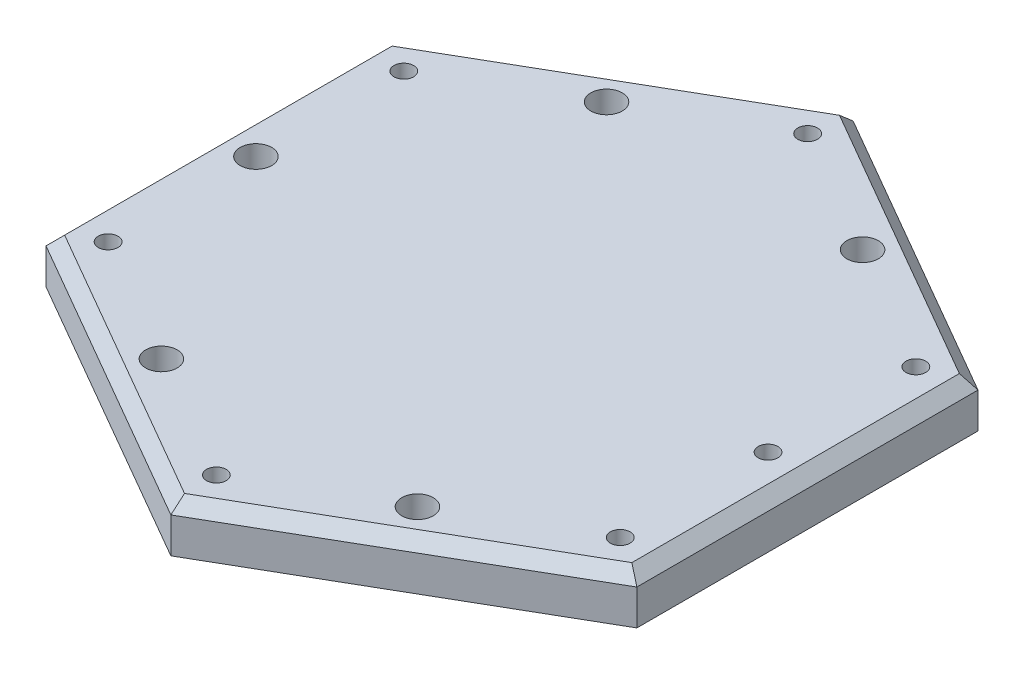
ISO-10303-21;
HEADER;
FILE_DESCRIPTION(('STEP AP214'),'2;1');
FILE_NAME('part.step','',(''),(''),'','','');
FILE_SCHEMA(('AUTOMOTIVE_DESIGN { 1 0 10303 214 1 1 1 1 }'));
ENDSEC;
DATA;
#1=APPLICATION_CONTEXT('core data for automotive mechanical design processes');
#2=APPLICATION_PROTOCOL_DEFINITION('international standard','automotive_design',2000,#1);
#3=PRODUCT_CONTEXT('',#1,'mechanical');
#4=PRODUCT('Part','Part','',(#3));
#5=PRODUCT_RELATED_PRODUCT_CATEGORY('part','',(#4));
#6=PRODUCT_DEFINITION_FORMATION('','',#4);
#7=PRODUCT_DEFINITION_CONTEXT('part definition',#1,'design');
#8=PRODUCT_DEFINITION('design','',#6,#7);
#9=PRODUCT_DEFINITION_SHAPE('','',#8);
#10=(LENGTH_UNIT() NAMED_UNIT(*) SI_UNIT(.MILLI.,.METRE.));
#11=(NAMED_UNIT(*) PLANE_ANGLE_UNIT() SI_UNIT($,.RADIAN.));
#12=(NAMED_UNIT(*) SI_UNIT($,.STERADIAN.) SOLID_ANGLE_UNIT());
#13=UNCERTAINTY_MEASURE_WITH_UNIT(LENGTH_MEASURE(1.E-05),#10,'distance_accuracy_value','');
#14=(GEOMETRIC_REPRESENTATION_CONTEXT(3) GLOBAL_UNCERTAINTY_ASSIGNED_CONTEXT((#13)) GLOBAL_UNIT_ASSIGNED_CONTEXT((#10,
#11,#12)) REPRESENTATION_CONTEXT('',''));
#15=CARTESIAN_POINT('',(0.,0.,0.));
#16=DIRECTION('',(0.,0.,1.));
#17=DIRECTION('',(1.,0.,0.));
#18=AXIS2_PLACEMENT_3D('',#15,#16,#17);
#19=CARTESIAN_POINT('',(74.9999999999996,12.,-43.3012701892228));
#20=DIRECTION('',(-0.499999999999995,0.,0.866025403784441));
#21=DIRECTION('',(0.866025403784442,0.,0.499999999999995));
#22=AXIS2_PLACEMENT_3D('',#19,#20,#21);
#23=PLANE('',#22);
#24=DIRECTION('',(0.,-1.,0.));
#25=VECTOR('',#24,1.);
#26=CARTESIAN_POINT('',(0.,12.,-86.6025403784439));
#27=LINE('',#26,#25);
#28=CARTESIAN_POINT('',(0.,9.,-86.6025403784439));
#29=VERTEX_POINT('',#28);
#30=CARTESIAN_POINT('',(0.,0.,-86.6025403784439));
#31=VERTEX_POINT('',#30);
#32=EDGE_CURVE('E109',#29,#31,#27,.T.);
#33=ORIENTED_EDGE('',*,*,#32,.F.);
#34=DIRECTION('',(0.866025403784442,0.,0.499999999999995));
#35=VECTOR('',#34,1.);
#36=CARTESIAN_POINT('',(74.9999999999996,9.,-43.3012701892228));
#37=LINE('',#36,#35);
#38=CARTESIAN_POINT('',(74.9999999999996,9.,-43.3012701892228));
#39=VERTEX_POINT('',#38);
#40=EDGE_CURVE('E11',#29,#39,#37,.T.);
#41=ORIENTED_EDGE('',*,*,#40,.T.);
#42=DIRECTION('',(0.,-1.,0.));
#43=VECTOR('',#42,1.);
#44=CARTESIAN_POINT('',(74.9999999999996,12.,-43.3012701892228));
#45=LINE('',#44,#43);
#46=CARTESIAN_POINT('',(74.9999999999996,0.,-43.3012701892228));
#47=VERTEX_POINT('',#46);
#48=EDGE_CURVE('E130',#39,#47,#45,.T.);
#49=ORIENTED_EDGE('',*,*,#48,.T.);
#50=DIRECTION('',(-0.866025403784442,0.,-0.499999999999995));
#51=VECTOR('',#50,1.);
#52=CARTESIAN_POINT('',(74.9999999999996,0.,-43.3012701892228));
#53=LINE('',#52,#51);
#54=EDGE_CURVE('E124',#47,#31,#53,.T.);
#55=ORIENTED_EDGE('',*,*,#54,.T.);
#56=EDGE_LOOP('',(#33,#41,#49,#55));
#57=FACE_BOUND('',#56,.T.);
#58=ADVANCED_FACE('F39',(#57),#23,.F.);
#59=CARTESIAN_POINT('',(0.,12.,-86.6025403784439));
#60=DIRECTION('',(0.500000000000001,0.,0.866025403784438));
#61=DIRECTION('',(0.866025403784438,0.,-0.500000000000001));
#62=AXIS2_PLACEMENT_3D('',#59,#60,#61);
#63=PLANE('',#62);
#64=DIRECTION('',(0.,-1.,0.));
#65=VECTOR('',#64,1.);
#66=CARTESIAN_POINT('',(-75.0000000000002,12.,-43.3012701892218));
#67=LINE('',#66,#65);
#68=CARTESIAN_POINT('',(-75.0000000000002,9.,-43.3012701892218));
#69=VERTEX_POINT('',#68);
#70=CARTESIAN_POINT('',(-75.0000000000002,0.,-43.3012701892218));
#71=VERTEX_POINT('',#70);
#72=EDGE_CURVE('E118',#69,#71,#67,.T.);
#73=ORIENTED_EDGE('',*,*,#72,.F.);
#74=DIRECTION('',(0.866025403784438,0.,-0.500000000000001));
#75=VECTOR('',#74,1.);
#76=CARTESIAN_POINT('',(0.,9.,-86.6025403784439));
#77=LINE('',#76,#75);
#78=EDGE_CURVE('E48',#69,#29,#77,.T.);
#79=ORIENTED_EDGE('',*,*,#78,.T.);
#80=ORIENTED_EDGE('',*,*,#32,.T.);
#81=DIRECTION('',(-0.866025403784438,0.,0.500000000000001));
#82=VECTOR('',#81,1.);
#83=CARTESIAN_POINT('',(0.,0.,-86.6025403784439));
#84=LINE('',#83,#82);
#85=EDGE_CURVE('E112',#31,#71,#84,.T.);
#86=ORIENTED_EDGE('',*,*,#85,.T.);
#87=EDGE_LOOP('',(#73,#79,#80,#86));
#88=FACE_BOUND('',#87,.T.);
#89=ADVANCED_FACE('F111',(#88),#63,.F.);
#90=CARTESIAN_POINT('',(-75.0000000000002,12.,-43.3012701892218));
#91=DIRECTION('',(1.,0.,0.));
#92=DIRECTION('',(0.,0.,-1.));
#93=AXIS2_PLACEMENT_3D('',#90,#91,#92);
#94=PLANE('',#93);
#95=DIRECTION('',(0.,-1.,0.));
#96=VECTOR('',#95,1.);
#97=CARTESIAN_POINT('',(-74.9999999999999,12.,43.3012701892223));
#98=LINE('',#97,#96);
#99=CARTESIAN_POINT('',(-74.9999999999999,9.,43.3012701892223));
#100=VERTEX_POINT('',#99);
#101=CARTESIAN_POINT('',(-74.9999999999999,0.,43.3012701892223));
#102=VERTEX_POINT('',#101);
#103=EDGE_CURVE('E153',#100,#102,#98,.T.);
#104=ORIENTED_EDGE('',*,*,#103,.F.);
#105=DIRECTION('',(0.,0.,-1.));
#106=VECTOR('',#105,1.);
#107=CARTESIAN_POINT('',(-75.0000000000002,9.,-43.3012701892218));
#108=LINE('',#107,#106);
#109=EDGE_CURVE('E63',#100,#69,#108,.T.);
#110=ORIENTED_EDGE('',*,*,#109,.T.);
#111=ORIENTED_EDGE('',*,*,#72,.T.);
#112=DIRECTION('',(0.,0.,1.));
#113=VECTOR('',#112,1.);
#114=CARTESIAN_POINT('',(-75.0000000000002,0.,-43.3012701892218));
#115=LINE('',#114,#113);
#116=EDGE_CURVE('E127',#71,#102,#115,.T.);
#117=ORIENTED_EDGE('',*,*,#116,.T.);
#118=EDGE_LOOP('',(#104,#110,#111,#117));
#119=FACE_BOUND('',#118,.T.);
#120=ADVANCED_FACE('F235',(#119),#94,.F.);
#121=CARTESIAN_POINT('',(-74.9999999999999,12.,43.3012701892223));
#122=DIRECTION('',(0.499999999999995,0.,-0.866025403784441));
#123=DIRECTION('',(-0.866025403784442,0.,-0.499999999999995));
#124=AXIS2_PLACEMENT_3D('',#121,#122,#123);
#125=PLANE('',#124);
#126=DIRECTION('',(0.,-1.,0.));
#127=VECTOR('',#126,1.);
#128=CARTESIAN_POINT('',(6.04742307255492E-13,12.,86.6025403784439));
#129=LINE('',#128,#127);
#130=CARTESIAN_POINT('',(6.04742307255492E-13,9.,86.6025403784439));
#131=VERTEX_POINT('',#130);
#132=CARTESIAN_POINT('',(6.04742307255492E-13,0.,86.6025403784439));
#133=VERTEX_POINT('',#132);
#134=EDGE_CURVE('E151',#131,#133,#129,.T.);
#135=ORIENTED_EDGE('',*,*,#134,.F.);
#136=DIRECTION('',(-0.866025403784442,0.,-0.499999999999995));
#137=VECTOR('',#136,1.);
#138=CARTESIAN_POINT('',(-74.9999999999999,9.,43.3012701892223));
#139=LINE('',#138,#137);
#140=EDGE_CURVE('E173',#131,#100,#139,.T.);
#141=ORIENTED_EDGE('',*,*,#140,.T.);
#142=ORIENTED_EDGE('',*,*,#103,.T.);
#143=DIRECTION('',(0.866025403784442,0.,0.499999999999995));
#144=VECTOR('',#143,1.);
#145=CARTESIAN_POINT('',(-74.9999999999999,0.,43.3012701892223));
#146=LINE('',#145,#144);
#147=EDGE_CURVE('E140',#102,#133,#146,.T.);
#148=ORIENTED_EDGE('',*,*,#147,.T.);
#149=EDGE_LOOP('',(#135,#141,#142,#148));
#150=FACE_BOUND('',#149,.T.);
#151=ADVANCED_FACE('F220',(#150),#125,.F.);
#152=CARTESIAN_POINT('',(6.04742307255492E-13,12.,86.6025403784439));
#153=DIRECTION('',(-0.500000000000007,0.,-0.866025403784434));
#154=DIRECTION('',(-0.866025403784435,0.,0.500000000000007));
#155=AXIS2_PLACEMENT_3D('',#152,#153,#154);
#156=PLANE('',#155);
#157=DIRECTION('',(0.,-1.,0.));
#158=VECTOR('',#157,1.);
#159=CARTESIAN_POINT('',(75.0000000000005,12.,43.3012701892213));
#160=LINE('',#159,#158);
#161=CARTESIAN_POINT('',(75.0000000000005,9.,43.3012701892213));
#162=VERTEX_POINT('',#161);
#163=CARTESIAN_POINT('',(75.0000000000005,0.,43.3012701892213));
#164=VERTEX_POINT('',#163);
#165=EDGE_CURVE('E149',#162,#164,#160,.T.);
#166=ORIENTED_EDGE('',*,*,#165,.F.);
#167=DIRECTION('',(-0.866025403784435,0.,0.500000000000007));
#168=VECTOR('',#167,1.);
#169=CARTESIAN_POINT('',(6.03825726444788E-13,9.,86.6025403784439));
#170=LINE('',#169,#168);
#171=EDGE_CURVE('E171',#162,#131,#170,.T.);
#172=ORIENTED_EDGE('',*,*,#171,.T.);
#173=ORIENTED_EDGE('',*,*,#134,.T.);
#174=DIRECTION('',(0.866025403784435,0.,-0.500000000000007));
#175=VECTOR('',#174,1.);
#176=CARTESIAN_POINT('',(6.04742307255492E-13,0.,86.6025403784439));
#177=LINE('',#176,#175);
#178=EDGE_CURVE('E143',#133,#164,#177,.T.);
#179=ORIENTED_EDGE('',*,*,#178,.T.);
#180=EDGE_LOOP('',(#166,#172,#173,#179));
#181=FACE_BOUND('',#180,.T.);
#182=ADVANCED_FACE('F217',(#181),#156,.F.);
#183=CARTESIAN_POINT('',(75.0000000000005,12.,43.3012701892213));
#184=DIRECTION('',(-1.,0.,0.));
#185=DIRECTION('',(0.,0.,1.));
#186=AXIS2_PLACEMENT_3D('',#183,#184,#185);
#187=PLANE('',#186);
#188=ORIENTED_EDGE('',*,*,#48,.F.);
#189=DIRECTION('',(0.,0.,1.));
#190=VECTOR('',#189,1.);
#191=CARTESIAN_POINT('',(75.0000000000005,9.,43.3012701892213));
#192=LINE('',#191,#190);
#193=EDGE_CURVE('E168',#39,#162,#192,.T.);
#194=ORIENTED_EDGE('',*,*,#193,.T.);
#195=ORIENTED_EDGE('',*,*,#165,.T.);
#196=DIRECTION('',(0.,0.,-1.));
#197=VECTOR('',#196,1.);
#198=CARTESIAN_POINT('',(75.0000000000005,0.,43.3012701892213));
#199=LINE('',#198,#197);
#200=EDGE_CURVE('E146',#164,#47,#199,.T.);
#201=ORIENTED_EDGE('',*,*,#200,.T.);
#202=EDGE_LOOP('',(#188,#194,#195,#201));
#203=FACE_BOUND('',#202,.T.);
#204=ADVANCED_FACE('F206',(#203),#187,.F.);
#205=CARTESIAN_POINT('',(0.,12.,0.));
#206=DIRECTION('',(0.,1.,0.));
#207=DIRECTION('',(0.,0.,1.));
#208=AXIS2_PLACEMENT_3D('',#205,#206,#207);
#209=PLANE('',#208);
#210=CARTESIAN_POINT('',(-65.,12.,0.));
#211=DIRECTION('',(0.,1.,0.));
#212=DIRECTION('',(0.,0.,1.));
#213=AXIS2_PLACEMENT_3D('',#210,#211,#212);
#214=CIRCLE('',#213,4.);
#215=CARTESIAN_POINT('',(-65.,12.,3.99999999999998));
#216=VERTEX_POINT('',#215);
#217=EDGE_CURVE('E474',#216,#216,#214,.T.);
#218=ORIENTED_EDGE('',*,*,#217,.F.);
#219=EDGE_LOOP('',(#218));
#220=FACE_BOUND('',#219,.T.);
#221=CARTESIAN_POINT('',(-32.5,12.,56.5));
#222=DIRECTION('',(0.,1.,0.));
#223=DIRECTION('',(0.,0.,1.));
#224=AXIS2_PLACEMENT_3D('',#221,#222,#223);
#225=CIRCLE('',#224,4.);
#226=CARTESIAN_POINT('',(-32.5,12.,60.5));
#227=VERTEX_POINT('',#226);
#228=EDGE_CURVE('E478',#227,#227,#225,.T.);
#229=ORIENTED_EDGE('',*,*,#228,.F.);
#230=EDGE_LOOP('',(#229));
#231=FACE_BOUND('',#230,.T.);
#232=CARTESIAN_POINT('',(32.5,12.,56.5));
#233=DIRECTION('',(0.,1.,0.));
#234=DIRECTION('',(0.,0.,1.));
#235=AXIS2_PLACEMENT_3D('',#232,#233,#234);
#236=CIRCLE('',#235,4.);
#237=CARTESIAN_POINT('',(32.5,12.,60.5));
#238=VERTEX_POINT('',#237);
#239=EDGE_CURVE('E482',#238,#238,#236,.T.);
#240=ORIENTED_EDGE('',*,*,#239,.F.);
#241=EDGE_LOOP('',(#240));
#242=FACE_BOUND('',#241,.T.);
#243=CARTESIAN_POINT('',(32.5,12.,-56.5));
#244=DIRECTION('',(0.,1.,0.));
#245=DIRECTION('',(0.,0.,1.));
#246=AXIS2_PLACEMENT_3D('',#243,#244,#245);
#247=CIRCLE('',#246,4.);
#248=CARTESIAN_POINT('',(32.5,12.,-52.5));
#249=VERTEX_POINT('',#248);
#250=EDGE_CURVE('E486',#249,#249,#247,.T.);
#251=ORIENTED_EDGE('',*,*,#250,.F.);
#252=EDGE_LOOP('',(#251));
#253=FACE_BOUND('',#252,.T.);
#254=CARTESIAN_POINT('',(-32.5,12.,-56.5));
#255=DIRECTION('',(0.,1.,0.));
#256=DIRECTION('',(0.,0.,1.));
#257=AXIS2_PLACEMENT_3D('',#254,#255,#256);
#258=CIRCLE('',#257,4.);
#259=CARTESIAN_POINT('',(-32.5,12.,-52.5));
#260=VERTEX_POINT('',#259);
#261=EDGE_CURVE('E490',#260,#260,#258,.T.);
#262=ORIENTED_EDGE('',*,*,#261,.F.);
#263=EDGE_LOOP('',(#262));
#264=FACE_BOUND('',#263,.T.);
#265=CARTESIAN_POINT('',(-65.,12.,37.5277674973257));
#266=DIRECTION('',(0.,1.,0.));
#267=DIRECTION('',(0.,0.,1.));
#268=AXIS2_PLACEMENT_3D('',#265,#266,#267);
#269=CIRCLE('',#268,2.49999999999999);
#270=CARTESIAN_POINT('',(-65.,12.,40.0277674973257));
#271=VERTEX_POINT('',#270);
#272=EDGE_CURVE('E494',#271,#271,#269,.T.);
#273=ORIENTED_EDGE('',*,*,#272,.F.);
#274=EDGE_LOOP('',(#273));
#275=FACE_BOUND('',#274,.T.);
#276=CARTESIAN_POINT('',(-65.,12.,-37.5277674973257));
#277=DIRECTION('',(0.,1.,0.));
#278=DIRECTION('',(0.,0.,1.));
#279=AXIS2_PLACEMENT_3D('',#276,#277,#278);
#280=CIRCLE('',#279,2.49999999999999);
#281=CARTESIAN_POINT('',(-65.,12.,-35.0277674973257));
#282=VERTEX_POINT('',#281);
#283=EDGE_CURVE('E498',#282,#282,#280,.T.);
#284=ORIENTED_EDGE('',*,*,#283,.F.);
#285=EDGE_LOOP('',(#284));
#286=FACE_BOUND('',#285,.T.);
#287=CARTESIAN_POINT('',(0.,12.,-75.0555349946514));
#288=DIRECTION('',(0.,1.,0.));
#289=DIRECTION('',(0.,0.,1.));
#290=AXIS2_PLACEMENT_3D('',#287,#288,#289);
#291=CIRCLE('',#290,2.49999999999999);
#292=CARTESIAN_POINT('',(0.,12.,-72.5555349946514));
#293=VERTEX_POINT('',#292);
#294=EDGE_CURVE('E502',#293,#293,#291,.T.);
#295=ORIENTED_EDGE('',*,*,#294,.F.);
#296=EDGE_LOOP('',(#295));
#297=FACE_BOUND('',#296,.T.);
#298=CARTESIAN_POINT('',(65.,12.,-37.5277674973257));
#299=DIRECTION('',(0.,1.,0.));
#300=DIRECTION('',(0.,0.,1.));
#301=AXIS2_PLACEMENT_3D('',#298,#299,#300);
#302=CIRCLE('',#301,2.49999999999999);
#303=CARTESIAN_POINT('',(65.,12.,-35.0277674973257));
#304=VERTEX_POINT('',#303);
#305=EDGE_CURVE('E506',#304,#304,#302,.T.);
#306=ORIENTED_EDGE('',*,*,#305,.F.);
#307=EDGE_LOOP('',(#306));
#308=FACE_BOUND('',#307,.T.);
#309=CARTESIAN_POINT('',(65.,12.,0.));
#310=DIRECTION('',(0.,1.,0.));
#311=DIRECTION('',(0.,0.,1.));
#312=AXIS2_PLACEMENT_3D('',#309,#310,#311);
#313=CIRCLE('',#312,2.49999999999999);
#314=CARTESIAN_POINT('',(65.,12.,2.5));
#315=VERTEX_POINT('',#314);
#316=EDGE_CURVE('E510',#315,#315,#313,.T.);
#317=ORIENTED_EDGE('',*,*,#316,.F.);
#318=EDGE_LOOP('',(#317));
#319=FACE_BOUND('',#318,.T.);
#320=CARTESIAN_POINT('',(0.,12.,75.0555349946514));
#321=DIRECTION('',(0.,1.,0.));
#322=DIRECTION('',(0.,0.,1.));
#323=AXIS2_PLACEMENT_3D('',#320,#321,#322);
#324=CIRCLE('',#323,2.49999999999999);
#325=CARTESIAN_POINT('',(0.,12.,77.5555349946514));
#326=VERTEX_POINT('',#325);
#327=EDGE_CURVE('E514',#326,#326,#324,.T.);
#328=ORIENTED_EDGE('',*,*,#327,.F.);
#329=EDGE_LOOP('',(#328));
#330=FACE_BOUND('',#329,.T.);
#331=CARTESIAN_POINT('',(65.,12.,37.5277674973257));
#332=DIRECTION('',(0.,1.,0.));
#333=DIRECTION('',(0.,0.,1.));
#334=AXIS2_PLACEMENT_3D('',#331,#332,#333);
#335=CIRCLE('',#334,2.49999999999999);
#336=CARTESIAN_POINT('',(65.,12.,40.0277674973257));
#337=VERTEX_POINT('',#336);
#338=EDGE_CURVE('E517',#337,#337,#335,.T.);
#339=ORIENTED_EDGE('',*,*,#338,.F.);
#340=EDGE_LOOP('',(#339));
#341=FACE_BOUND('',#340,.T.);
#342=DIRECTION('',(0.866025403784435,0.,-0.500000000000007));
#343=VECTOR('',#342,1.);
#344=CARTESIAN_POINT('',(73.5000000000004,12.,40.703193977868));
#345=LINE('',#344,#343);
#346=CARTESIAN_POINT('',(5.69315350748224E-13,12.,83.1384387633062));
#347=VERTEX_POINT('',#346);
#348=CARTESIAN_POINT('',(72.0000000000004,12.,41.5692193816524));
#349=VERTEX_POINT('',#348);
#350=EDGE_CURVE('E163',#347,#349,#345,.T.);
#351=ORIENTED_EDGE('',*,*,#350,.T.);
#352=DIRECTION('',(0.,0.,-1.));
#353=VECTOR('',#352,1.);
#354=CARTESIAN_POINT('',(71.9999999999995,12.,-43.3012701892228));
#355=LINE('',#354,#353);
#356=CARTESIAN_POINT('',(71.9999999999996,12.,-41.5692193816539));
#357=VERTEX_POINT('',#356);
#358=EDGE_CURVE('E165',#349,#357,#355,.T.);
#359=ORIENTED_EDGE('',*,*,#358,.T.);
#360=DIRECTION('',(-0.866025403784442,0.,-0.499999999999995));
#361=VECTOR('',#360,1.);
#362=CARTESIAN_POINT('',(-1.5,12.,-84.0044641670906));
#363=LINE('',#362,#361);
#364=CARTESIAN_POINT('',(0.,12.,-83.1384387633062));
#365=VERTEX_POINT('',#364);
#366=EDGE_CURVE('E117',#357,#365,#363,.T.);
#367=ORIENTED_EDGE('',*,*,#366,.T.);
#368=DIRECTION('',(-0.866025403784438,0.,0.500000000000001));
#369=VECTOR('',#368,1.);
#370=CARTESIAN_POINT('',(-73.5000000000002,12.,-40.7031939778685));
#371=LINE('',#370,#369);
#372=CARTESIAN_POINT('',(-72.0000000000002,12.,-41.5692193816529));
#373=VERTEX_POINT('',#372);
#374=EDGE_CURVE('E157',#365,#373,#371,.T.);
#375=ORIENTED_EDGE('',*,*,#374,.T.);
#376=DIRECTION('',(0.,0.,1.));
#377=VECTOR('',#376,1.);
#378=CARTESIAN_POINT('',(-71.9999999999999,12.,43.3012701892223));
#379=LINE('',#378,#377);
#380=CARTESIAN_POINT('',(-71.9999999999999,12.,41.5692193816534));
#381=VERTEX_POINT('',#380);
#382=EDGE_CURVE('E159',#373,#381,#379,.T.);
#383=ORIENTED_EDGE('',*,*,#382,.T.);
#384=DIRECTION('',(0.866025403784442,0.,0.499999999999995));
#385=VECTOR('',#384,1.);
#386=CARTESIAN_POINT('',(1.50000000000059,12.,84.0044641670906));
#387=LINE('',#386,#385);
#388=EDGE_CURVE('E161',#381,#347,#387,.T.);
#389=ORIENTED_EDGE('',*,*,#388,.T.);
#390=EDGE_LOOP('',(#351,#359,#367,#375,#383,#389));
#391=FACE_BOUND('',#390,.T.);
#392=ADVANCED_FACE('F196',(#220,#231,#242,#253,#264,#275,#286,#297,#308,#319,#330,#341,#391),
#209,.T.);
#393=CARTESIAN_POINT('',(0.,0.,0.));
#394=DIRECTION('',(0.,1.,0.));
#395=DIRECTION('',(0.,0.,1.));
#396=AXIS2_PLACEMENT_3D('',#393,#394,#395);
#397=PLANE('',#396);
#398=CARTESIAN_POINT('',(-65.,0.,0.));
#399=DIRECTION('',(0.,1.,0.));
#400=DIRECTION('',(0.,0.,1.));
#401=AXIS2_PLACEMENT_3D('',#398,#399,#400);
#402=CIRCLE('',#401,4.);
#403=CARTESIAN_POINT('',(-65.,0.,3.99999999999998));
#404=VERTEX_POINT('',#403);
#405=EDGE_CURVE('E561',#404,#404,#402,.T.);
#406=ORIENTED_EDGE('',*,*,#405,.T.);
#407=EDGE_LOOP('',(#406));
#408=FACE_BOUND('',#407,.T.);
#409=CARTESIAN_POINT('',(-32.5,0.,56.5));
#410=DIRECTION('',(0.,1.,0.));
#411=DIRECTION('',(0.,0.,1.));
#412=AXIS2_PLACEMENT_3D('',#409,#410,#411);
#413=CIRCLE('',#412,4.);
#414=CARTESIAN_POINT('',(-32.5,0.,60.5));
#415=VERTEX_POINT('',#414);
#416=EDGE_CURVE('E557',#415,#415,#413,.T.);
#417=ORIENTED_EDGE('',*,*,#416,.T.);
#418=EDGE_LOOP('',(#417));
#419=FACE_BOUND('',#418,.T.);
#420=CARTESIAN_POINT('',(32.5,0.,56.5));
#421=DIRECTION('',(0.,1.,0.));
#422=DIRECTION('',(0.,0.,1.));
#423=AXIS2_PLACEMENT_3D('',#420,#421,#422);
#424=CIRCLE('',#423,4.);
#425=CARTESIAN_POINT('',(32.5,0.,60.5));
#426=VERTEX_POINT('',#425);
#427=EDGE_CURVE('E553',#426,#426,#424,.T.);
#428=ORIENTED_EDGE('',*,*,#427,.T.);
#429=EDGE_LOOP('',(#428));
#430=FACE_BOUND('',#429,.T.);
#431=CARTESIAN_POINT('',(32.5,0.,-56.5));
#432=DIRECTION('',(0.,1.,0.));
#433=DIRECTION('',(0.,0.,1.));
#434=AXIS2_PLACEMENT_3D('',#431,#432,#433);
#435=CIRCLE('',#434,4.);
#436=CARTESIAN_POINT('',(32.5,0.,-52.5));
#437=VERTEX_POINT('',#436);
#438=EDGE_CURVE('E549',#437,#437,#435,.T.);
#439=ORIENTED_EDGE('',*,*,#438,.T.);
#440=EDGE_LOOP('',(#439));
#441=FACE_BOUND('',#440,.T.);
#442=CARTESIAN_POINT('',(-32.5,0.,-56.5));
#443=DIRECTION('',(0.,1.,0.));
#444=DIRECTION('',(0.,0.,1.));
#445=AXIS2_PLACEMENT_3D('',#442,#443,#444);
#446=CIRCLE('',#445,4.);
#447=CARTESIAN_POINT('',(-32.5,0.,-52.5));
#448=VERTEX_POINT('',#447);
#449=EDGE_CURVE('E545',#448,#448,#446,.T.);
#450=ORIENTED_EDGE('',*,*,#449,.T.);
#451=EDGE_LOOP('',(#450));
#452=FACE_BOUND('',#451,.T.);
#453=CARTESIAN_POINT('',(-65.,0.,37.5277674973257));
#454=DIRECTION('',(0.,1.,0.));
#455=DIRECTION('',(0.,0.,1.));
#456=AXIS2_PLACEMENT_3D('',#453,#454,#455);
#457=CIRCLE('',#456,2.5);
#458=CARTESIAN_POINT('',(-65.,0.,40.0277674973257));
#459=VERTEX_POINT('',#458);
#460=EDGE_CURVE('E541',#459,#459,#457,.T.);
#461=ORIENTED_EDGE('',*,*,#460,.T.);
#462=EDGE_LOOP('',(#461));
#463=FACE_BOUND('',#462,.T.);
#464=CARTESIAN_POINT('',(-65.,0.,-37.5277674973257));
#465=DIRECTION('',(0.,1.,0.));
#466=DIRECTION('',(0.,0.,1.));
#467=AXIS2_PLACEMENT_3D('',#464,#465,#466);
#468=CIRCLE('',#467,2.5);
#469=CARTESIAN_POINT('',(-65.,0.,-35.0277674973257));
#470=VERTEX_POINT('',#469);
#471=EDGE_CURVE('E537',#470,#470,#468,.T.);
#472=ORIENTED_EDGE('',*,*,#471,.T.);
#473=EDGE_LOOP('',(#472));
#474=FACE_BOUND('',#473,.T.);
#475=CARTESIAN_POINT('',(0.,0.,-75.0555349946514));
#476=DIRECTION('',(0.,1.,0.));
#477=DIRECTION('',(0.,0.,1.));
#478=AXIS2_PLACEMENT_3D('',#475,#476,#477);
#479=CIRCLE('',#478,2.5);
#480=CARTESIAN_POINT('',(0.,0.,-72.5555349946514));
#481=VERTEX_POINT('',#480);
#482=EDGE_CURVE('E533',#481,#481,#479,.T.);
#483=ORIENTED_EDGE('',*,*,#482,.T.);
#484=EDGE_LOOP('',(#483));
#485=FACE_BOUND('',#484,.T.);
#486=CARTESIAN_POINT('',(65.,0.,-37.5277674973257));
#487=DIRECTION('',(0.,1.,0.));
#488=DIRECTION('',(0.,0.,1.));
#489=AXIS2_PLACEMENT_3D('',#486,#487,#488);
#490=CIRCLE('',#489,2.5);
#491=CARTESIAN_POINT('',(65.,0.,-35.0277674973257));
#492=VERTEX_POINT('',#491);
#493=EDGE_CURVE('E529',#492,#492,#490,.T.);
#494=ORIENTED_EDGE('',*,*,#493,.T.);
#495=EDGE_LOOP('',(#494));
#496=FACE_BOUND('',#495,.T.);
#497=CARTESIAN_POINT('',(65.,0.,0.));
#498=DIRECTION('',(0.,1.,0.));
#499=DIRECTION('',(0.,0.,1.));
#500=AXIS2_PLACEMENT_3D('',#497,#498,#499);
#501=CIRCLE('',#500,2.5);
#502=CARTESIAN_POINT('',(65.,0.,2.50000000000001));
#503=VERTEX_POINT('',#502);
#504=EDGE_CURVE('E525',#503,#503,#501,.T.);
#505=ORIENTED_EDGE('',*,*,#504,.T.);
#506=EDGE_LOOP('',(#505));
#507=FACE_BOUND('',#506,.T.);
#508=CARTESIAN_POINT('',(0.,0.,75.0555349946514));
#509=DIRECTION('',(0.,1.,0.));
#510=DIRECTION('',(0.,0.,1.));
#511=AXIS2_PLACEMENT_3D('',#508,#509,#510);
#512=CIRCLE('',#511,2.5);
#513=CARTESIAN_POINT('',(0.,0.,77.5555349946514));
#514=VERTEX_POINT('',#513);
#515=EDGE_CURVE('E519',#514,#514,#512,.T.);
#516=ORIENTED_EDGE('',*,*,#515,.T.);
#517=EDGE_LOOP('',(#516));
#518=FACE_BOUND('',#517,.T.);
#519=CARTESIAN_POINT('',(65.,0.,37.5277674973257));
#520=DIRECTION('',(0.,1.,0.));
#521=DIRECTION('',(0.,0.,1.));
#522=AXIS2_PLACEMENT_3D('',#519,#520,#521);
#523=CIRCLE('',#522,2.5);
#524=CARTESIAN_POINT('',(65.,0.,40.0277674973257));
#525=VERTEX_POINT('',#524);
#526=EDGE_CURVE('E136',#525,#525,#523,.T.);
#527=ORIENTED_EDGE('',*,*,#526,.T.);
#528=EDGE_LOOP('',(#527));
#529=FACE_BOUND('',#528,.T.);
#530=ORIENTED_EDGE('',*,*,#54,.F.);
#531=ORIENTED_EDGE('',*,*,#200,.F.);
#532=ORIENTED_EDGE('',*,*,#178,.F.);
#533=ORIENTED_EDGE('',*,*,#147,.F.);
#534=ORIENTED_EDGE('',*,*,#116,.F.);
#535=ORIENTED_EDGE('',*,*,#85,.F.);
#536=EDGE_LOOP('',(#530,#531,#532,#533,#534,#535));
#537=FACE_BOUND('',#536,.T.);
#538=ADVANCED_FACE('F122',(#408,#419,#430,#441,#452,#463,#474,#485,#496,#507,#518,#529,#537),
#397,.F.);
#539=CARTESIAN_POINT('',(-72.,12.,2.5383107460263E-13));
#540=DIRECTION('',(-0.707106781186547,0.707106781186547,0.));
#541=DIRECTION('',(0.,0.,-1.));
#542=AXIS2_PLACEMENT_3D('',#539,#540,#541);
#543=PLANE('',#542);
#544=DIRECTION('',(0.654653670707978,0.654653670707977,0.377964473009226));
#545=VECTOR('',#544,1.);
#546=CARTESIAN_POINT('',(-61.7142857142858,22.2857142857143,-35.6307594699882));
#547=LINE('',#546,#545);
#548=EDGE_CURVE('E134',#69,#373,#547,.T.);
#549=ORIENTED_EDGE('',*,*,#548,.F.);
#550=ORIENTED_EDGE('',*,*,#109,.F.);
#551=DIRECTION('',(0.654653670707976,0.654653670707977,-0.37796447300923));
#552=VECTOR('',#551,1.);
#553=CARTESIAN_POINT('',(-61.7142857142856,22.2857142857143,35.6307594699886));
#554=LINE('',#553,#552);
#555=EDGE_CURVE('E43',#381,#100,#554,.F.);
#556=ORIENTED_EDGE('',*,*,#555,.F.);
#557=ORIENTED_EDGE('',*,*,#382,.F.);
#558=EDGE_LOOP('',(#549,#550,#556,#557));
#559=FACE_BOUND('',#558,.T.);
#560=ADVANCED_FACE('F41',(#559),#543,.T.);
#561=CARTESIAN_POINT('',(-35.9999999999996,12.,62.3538290724798));
#562=DIRECTION('',(-0.35355339059327,0.707106781186547,0.612372435695797));
#563=DIRECTION('',(-0.866025403784442,0.,-0.499999999999995));
#564=AXIS2_PLACEMENT_3D('',#561,#562,#563);
#565=PLANE('',#564);
#566=ORIENTED_EDGE('',*,*,#555,.T.);
#567=ORIENTED_EDGE('',*,*,#140,.F.);
#568=DIRECTION('',(0.,0.654653670707976,-0.755928946018455));
#569=VECTOR('',#568,1.);
#570=CARTESIAN_POINT('',(4.5102810375397E-13,22.2857142857144,71.2615189399766));
#571=LINE('',#570,#569);
#572=EDGE_CURVE('E184',#347,#131,#571,.F.);
#573=ORIENTED_EDGE('',*,*,#572,.F.);
#574=ORIENTED_EDGE('',*,*,#388,.F.);
#575=EDGE_LOOP('',(#566,#567,#573,#574));
#576=FACE_BOUND('',#575,.T.);
#577=ADVANCED_FACE('F223',(#576),#565,.T.);
#578=CARTESIAN_POINT('',(-36.0000000000001,12.,-62.3538290724795));
#579=DIRECTION('',(-0.353553390593274,0.707106781186547,-0.612372435695794));
#580=DIRECTION('',(0.866025403784438,0.,-0.500000000000001));
#581=AXIS2_PLACEMENT_3D('',#578,#579,#580);
#582=PLANE('',#581);
#583=ORIENTED_EDGE('',*,*,#548,.T.);
#584=ORIENTED_EDGE('',*,*,#374,.F.);
#585=DIRECTION('',(0.,0.654653670707977,0.755928946018455));
#586=VECTOR('',#585,1.);
#587=CARTESIAN_POINT('',(0.,22.2857142857141,-71.2615189399769));
#588=LINE('',#587,#586);
#589=EDGE_CURVE('E181',#29,#365,#588,.T.);
#590=ORIENTED_EDGE('',*,*,#589,.F.);
#591=ORIENTED_EDGE('',*,*,#78,.F.);
#592=EDGE_LOOP('',(#583,#584,#590,#591));
#593=FACE_BOUND('',#592,.T.);
#594=ADVANCED_FACE('F190',(#593),#582,.T.);
#595=CARTESIAN_POINT('',(36.0000000000005,12.,62.3538290724793));
#596=DIRECTION('',(0.353553390593278,0.707106781186549,0.612372435695791));
#597=DIRECTION('',(-0.866025403784435,0.,0.500000000000007));
#598=AXIS2_PLACEMENT_3D('',#595,#596,#597);
#599=PLANE('',#598);
#600=ORIENTED_EDGE('',*,*,#572,.T.);
#601=ORIENTED_EDGE('',*,*,#171,.F.);
#602=DIRECTION('',(-0.654653670707979,0.654653670707977,-0.377964473009224));
#603=VECTOR('',#602,1.);
#604=CARTESIAN_POINT('',(61.7142857142861,22.2857142857142,35.6307594699877));
#605=LINE('',#604,#603);
#606=EDGE_CURVE('E179',#349,#162,#605,.F.);
#607=ORIENTED_EDGE('',*,*,#606,.F.);
#608=ORIENTED_EDGE('',*,*,#350,.F.);
#609=EDGE_LOOP('',(#600,#601,#607,#608));
#610=FACE_BOUND('',#609,.T.);
#611=ADVANCED_FACE('F214',(#610),#599,.T.);
#612=CARTESIAN_POINT('',(35.9999999999998,12.,-62.35382907248));
#613=DIRECTION('',(0.35355339059327,0.707106781186549,-0.612372435695796));
#614=DIRECTION('',(0.866025403784442,0.,0.499999999999995));
#615=AXIS2_PLACEMENT_3D('',#612,#613,#614);
#616=PLANE('',#615);
#617=ORIENTED_EDGE('',*,*,#589,.T.);
#618=ORIENTED_EDGE('',*,*,#366,.F.);
#619=DIRECTION('',(0.654653670707972,-0.654653670707977,-0.377964473009236));
#620=VECTOR('',#619,1.);
#621=CARTESIAN_POINT('',(61.7142857142856,22.2857142857141,-35.6307594699892));
#622=LINE('',#621,#620);
#623=EDGE_CURVE('E177',#39,#357,#622,.F.);
#624=ORIENTED_EDGE('',*,*,#623,.F.);
#625=ORIENTED_EDGE('',*,*,#40,.F.);
#626=EDGE_LOOP('',(#617,#618,#624,#625));
#627=FACE_BOUND('',#626,.T.);
#628=ADVANCED_FACE('F202',(#627),#616,.T.);
#629=CARTESIAN_POINT('',(72.,12.,-7.49955447689588E-13));
#630=DIRECTION('',(0.707106781186548,0.707106781186547,0.));
#631=DIRECTION('',(0.,0.,1.));
#632=AXIS2_PLACEMENT_3D('',#629,#630,#631);
#633=PLANE('',#632);
#634=ORIENTED_EDGE('',*,*,#606,.T.);
#635=ORIENTED_EDGE('',*,*,#193,.F.);
#636=ORIENTED_EDGE('',*,*,#623,.T.);
#637=ORIENTED_EDGE('',*,*,#358,.F.);
#638=EDGE_LOOP('',(#634,#635,#636,#637));
#639=FACE_BOUND('',#638,.T.);
#640=ADVANCED_FACE('F209',(#639),#633,.T.);
#641=CARTESIAN_POINT('',(65.,12.,37.5277674973257));
#642=DIRECTION('',(0.,1.,0.));
#643=DIRECTION('',(0.,0.,1.));
#644=AXIS2_PLACEMENT_3D('',#641,#642,#643);
#645=CYLINDRICAL_SURFACE('',#644,2.5);
#646=ORIENTED_EDGE('',*,*,#526,.F.);
#647=EDGE_LOOP('',(#646));
#648=FACE_BOUND('',#647,.T.);
#649=ORIENTED_EDGE('',*,*,#338,.T.);
#650=EDGE_LOOP('',(#649));
#651=FACE_BOUND('',#650,.T.);
#652=ADVANCED_FACE('F241',(#648,#651),#645,.F.);
#653=CARTESIAN_POINT('',(0.,12.,75.0555349946514));
#654=DIRECTION('',(0.,1.,0.));
#655=DIRECTION('',(0.,0.,1.));
#656=AXIS2_PLACEMENT_3D('',#653,#654,#655);
#657=CYLINDRICAL_SURFACE('',#656,2.49999999999999);
#658=ORIENTED_EDGE('',*,*,#515,.F.);
#659=EDGE_LOOP('',(#658));
#660=FACE_BOUND('',#659,.T.);
#661=ORIENTED_EDGE('',*,*,#327,.T.);
#662=EDGE_LOOP('',(#661));
#663=FACE_BOUND('',#662,.T.);
#664=ADVANCED_FACE('F264',(#660,#663),#657,.F.);
#665=CARTESIAN_POINT('',(65.,12.,0.));
#666=DIRECTION('',(0.,1.,0.));
#667=DIRECTION('',(0.,0.,1.));
#668=AXIS2_PLACEMENT_3D('',#665,#666,#667);
#669=CYLINDRICAL_SURFACE('',#668,2.5);
#670=ORIENTED_EDGE('',*,*,#504,.F.);
#671=EDGE_LOOP('',(#670));
#672=FACE_BOUND('',#671,.T.);
#673=ORIENTED_EDGE('',*,*,#316,.T.);
#674=EDGE_LOOP('',(#673));
#675=FACE_BOUND('',#674,.T.);
#676=ADVANCED_FACE('F271',(#672,#675),#669,.F.);
#677=CARTESIAN_POINT('',(65.,12.,-37.5277674973257));
#678=DIRECTION('',(0.,1.,0.));
#679=DIRECTION('',(0.,0.,1.));
#680=AXIS2_PLACEMENT_3D('',#677,#678,#679);
#681=CYLINDRICAL_SURFACE('',#680,2.5);
#682=ORIENTED_EDGE('',*,*,#493,.F.);
#683=EDGE_LOOP('',(#682));
#684=FACE_BOUND('',#683,.T.);
#685=ORIENTED_EDGE('',*,*,#305,.T.);
#686=EDGE_LOOP('',(#685));
#687=FACE_BOUND('',#686,.T.);
#688=ADVANCED_FACE('F279',(#684,#687),#681,.F.);
#689=CARTESIAN_POINT('',(0.,12.,-75.0555349946514));
#690=DIRECTION('',(0.,1.,0.));
#691=DIRECTION('',(0.,0.,1.));
#692=AXIS2_PLACEMENT_3D('',#689,#690,#691);
#693=CYLINDRICAL_SURFACE('',#692,2.49999999999999);
#694=ORIENTED_EDGE('',*,*,#482,.F.);
#695=EDGE_LOOP('',(#694));
#696=FACE_BOUND('',#695,.T.);
#697=ORIENTED_EDGE('',*,*,#294,.T.);
#698=EDGE_LOOP('',(#697));
#699=FACE_BOUND('',#698,.T.);
#700=ADVANCED_FACE('F287',(#696,#699),#693,.F.);
#701=CARTESIAN_POINT('',(-65.,12.,-37.5277674973257));
#702=DIRECTION('',(0.,1.,0.));
#703=DIRECTION('',(0.,0.,1.));
#704=AXIS2_PLACEMENT_3D('',#701,#702,#703);
#705=CYLINDRICAL_SURFACE('',#704,2.5);
#706=ORIENTED_EDGE('',*,*,#471,.F.);
#707=EDGE_LOOP('',(#706));
#708=FACE_BOUND('',#707,.T.);
#709=ORIENTED_EDGE('',*,*,#283,.T.);
#710=EDGE_LOOP('',(#709));
#711=FACE_BOUND('',#710,.T.);
#712=ADVANCED_FACE('F295',(#708,#711),#705,.F.);
#713=CARTESIAN_POINT('',(-65.,12.,37.5277674973257));
#714=DIRECTION('',(0.,1.,0.));
#715=DIRECTION('',(0.,0.,1.));
#716=AXIS2_PLACEMENT_3D('',#713,#714,#715);
#717=CYLINDRICAL_SURFACE('',#716,2.5);
#718=ORIENTED_EDGE('',*,*,#460,.F.);
#719=EDGE_LOOP('',(#718));
#720=FACE_BOUND('',#719,.T.);
#721=ORIENTED_EDGE('',*,*,#272,.T.);
#722=EDGE_LOOP('',(#721));
#723=FACE_BOUND('',#722,.T.);
#724=ADVANCED_FACE('F303',(#720,#723),#717,.F.);
#725=CARTESIAN_POINT('',(-32.5,12.,-56.5));
#726=DIRECTION('',(0.,1.,0.));
#727=DIRECTION('',(0.,0.,1.));
#728=AXIS2_PLACEMENT_3D('',#725,#726,#727);
#729=CYLINDRICAL_SURFACE('',#728,4.);
#730=ORIENTED_EDGE('',*,*,#449,.F.);
#731=EDGE_LOOP('',(#730));
#732=FACE_BOUND('',#731,.T.);
#733=ORIENTED_EDGE('',*,*,#261,.T.);
#734=EDGE_LOOP('',(#733));
#735=FACE_BOUND('',#734,.T.);
#736=ADVANCED_FACE('F311',(#732,#735),#729,.F.);
#737=CARTESIAN_POINT('',(32.5,12.,-56.5));
#738=DIRECTION('',(0.,1.,0.));
#739=DIRECTION('',(0.,0.,1.));
#740=AXIS2_PLACEMENT_3D('',#737,#738,#739);
#741=CYLINDRICAL_SURFACE('',#740,4.);
#742=ORIENTED_EDGE('',*,*,#438,.F.);
#743=EDGE_LOOP('',(#742));
#744=FACE_BOUND('',#743,.T.);
#745=ORIENTED_EDGE('',*,*,#250,.T.);
#746=EDGE_LOOP('',(#745));
#747=FACE_BOUND('',#746,.T.);
#748=ADVANCED_FACE('F319',(#744,#747),#741,.F.);
#749=CARTESIAN_POINT('',(32.5,12.,56.5));
#750=DIRECTION('',(0.,1.,0.));
#751=DIRECTION('',(0.,0.,1.));
#752=AXIS2_PLACEMENT_3D('',#749,#750,#751);
#753=CYLINDRICAL_SURFACE('',#752,4.);
#754=ORIENTED_EDGE('',*,*,#427,.F.);
#755=EDGE_LOOP('',(#754));
#756=FACE_BOUND('',#755,.T.);
#757=ORIENTED_EDGE('',*,*,#239,.T.);
#758=EDGE_LOOP('',(#757));
#759=FACE_BOUND('',#758,.T.);
#760=ADVANCED_FACE('F328',(#756,#759),#753,.F.);
#761=CARTESIAN_POINT('',(-32.5,12.,56.5));
#762=DIRECTION('',(0.,1.,0.));
#763=DIRECTION('',(0.,0.,1.));
#764=AXIS2_PLACEMENT_3D('',#761,#762,#763);
#765=CYLINDRICAL_SURFACE('',#764,4.);
#766=ORIENTED_EDGE('',*,*,#416,.F.);
#767=EDGE_LOOP('',(#766));
#768=FACE_BOUND('',#767,.T.);
#769=ORIENTED_EDGE('',*,*,#228,.T.);
#770=EDGE_LOOP('',(#769));
#771=FACE_BOUND('',#770,.T.);
#772=ADVANCED_FACE('F336',(#768,#771),#765,.F.);
#773=CARTESIAN_POINT('',(-65.,12.,0.));
#774=DIRECTION('',(0.,1.,0.));
#775=DIRECTION('',(0.,0.,1.));
#776=AXIS2_PLACEMENT_3D('',#773,#774,#775);
#777=CYLINDRICAL_SURFACE('',#776,4.);
#778=ORIENTED_EDGE('',*,*,#405,.F.);
#779=EDGE_LOOP('',(#778));
#780=FACE_BOUND('',#779,.T.);
#781=ORIENTED_EDGE('',*,*,#217,.T.);
#782=EDGE_LOOP('',(#781));
#783=FACE_BOUND('',#782,.T.);
#784=ADVANCED_FACE('F344',(#780,#783),#777,.F.);
#785=CLOSED_SHELL('',(#58,#89,#120,#151,#182,#204,#392,#538,#560,#577,#594,#611,#628,#640,#652,
#664,#676,#688,#700,#712,#724,#736,#748,#760,#772,#784));
#786=MANIFOLD_SOLID_BREP('B2',#785);
#787=ADVANCED_BREP_SHAPE_REPRESENTATION('',(#18,#786),#14);
#788=SHAPE_DEFINITION_REPRESENTATION(#9,#787);
ENDSEC;
END-ISO-10303-21;
